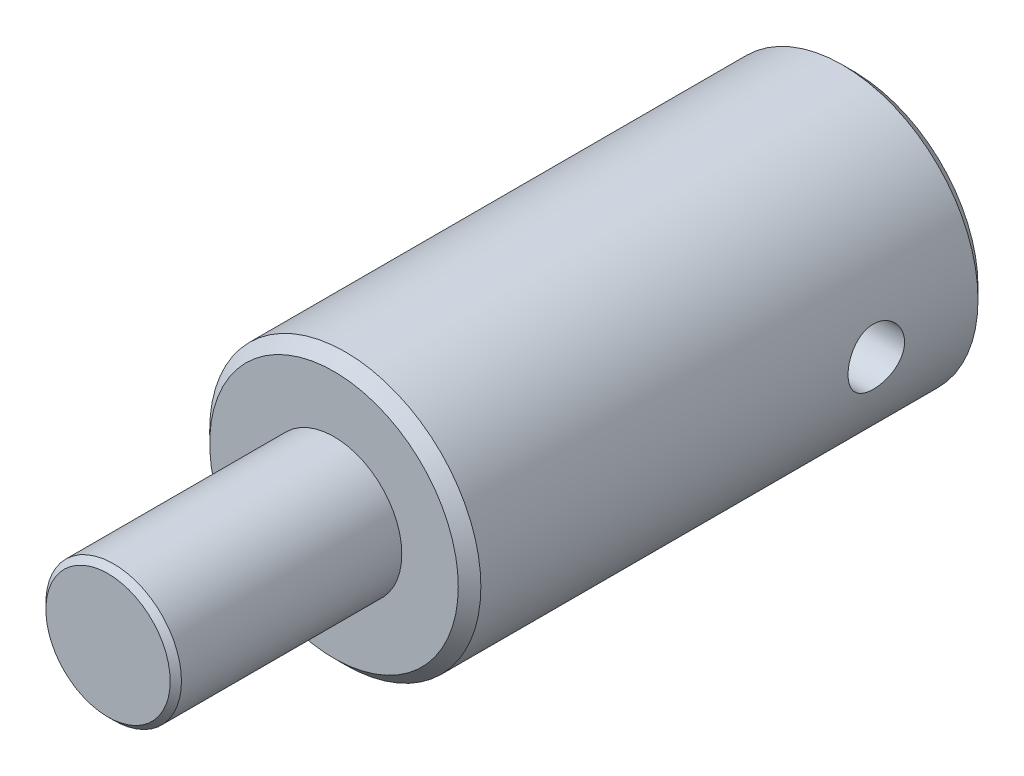
ISO-10303-21;
HEADER;
FILE_DESCRIPTION(('STEP AP214'),'2;1');
FILE_NAME('part.step','',(''),(''),'','','');
FILE_SCHEMA(('AUTOMOTIVE_DESIGN { 1 0 10303 214 1 1 1 1 }'));
ENDSEC;
DATA;
#1=APPLICATION_CONTEXT('core data for automotive mechanical design processes');
#2=APPLICATION_PROTOCOL_DEFINITION('international standard','automotive_design',2000,#1);
#3=PRODUCT_CONTEXT('',#1,'mechanical');
#4=PRODUCT('Part','Part','',(#3));
#5=PRODUCT_RELATED_PRODUCT_CATEGORY('part','',(#4));
#6=PRODUCT_DEFINITION_FORMATION('','',#4);
#7=PRODUCT_DEFINITION_CONTEXT('part definition',#1,'design');
#8=PRODUCT_DEFINITION('design','',#6,#7);
#9=PRODUCT_DEFINITION_SHAPE('','',#8);
#10=(LENGTH_UNIT() NAMED_UNIT(*) SI_UNIT(.MILLI.,.METRE.));
#11=(NAMED_UNIT(*) PLANE_ANGLE_UNIT() SI_UNIT($,.RADIAN.));
#12=(NAMED_UNIT(*) SI_UNIT($,.STERADIAN.) SOLID_ANGLE_UNIT());
#13=UNCERTAINTY_MEASURE_WITH_UNIT(LENGTH_MEASURE(1.E-05),#10,'distance_accuracy_value','');
#14=(GEOMETRIC_REPRESENTATION_CONTEXT(3) GLOBAL_UNCERTAINTY_ASSIGNED_CONTEXT((#13)) GLOBAL_UNIT_ASSIGNED_CONTEXT((#10,
#11,#12)) REPRESENTATION_CONTEXT('',''));
#15=CARTESIAN_POINT('',(0.,0.,0.));
#16=DIRECTION('',(0.,0.,1.));
#17=DIRECTION('',(1.,0.,0.));
#18=AXIS2_PLACEMENT_3D('',#15,#16,#17);
#19=CARTESIAN_POINT('',(0.,0.,23.));
#20=DIRECTION('',(0.,0.,-1.));
#21=DIRECTION('',(-1.,0.,0.));
#22=AXIS2_PLACEMENT_3D('',#19,#20,#21);
#23=CYLINDRICAL_SURFACE('',#22,6.);
#24=CARTESIAN_POINT('',(-6.,0.,3.75));
#25=CARTESIAN_POINT('',(-5.99999871526651,0.0694090417016607,3.75000247746922));
#26=CARTESIAN_POINT('',(-5.99878328775043,0.138848789520876,3.75580066571875));
#27=CARTESIAN_POINT('',(-5.9940520099068,0.275761316266993,3.77881934953285));
#28=CARTESIAN_POINT('',(-5.99053441189248,0.343232560128313,3.79604852303693));
#29=CARTESIAN_POINT('',(-5.98159109196202,0.474209132291342,3.84137045492182));
#30=CARTESIAN_POINT('',(-5.97616727052645,0.537718336709185,3.86945239599889));
#31=CARTESIAN_POINT('',(-5.96399927809859,0.659120328605958,3.93564960885618));
#32=CARTESIAN_POINT('',(-5.95725516625975,0.717013367534327,3.97376443115583));
#33=CARTESIAN_POINT('',(-5.9430770002465,0.826390324308837,4.05953634019064));
#34=CARTESIAN_POINT('',(-5.93563505848532,0.877780244162685,4.10731200123508));
#35=CARTESIAN_POINT('',(-5.92095657692448,0.971877776769393,4.21079465919511));
#36=CARTESIAN_POINT('',(-5.91372005416683,1.01458467096099,4.26650231187226));
#37=CARTESIAN_POINT('',(-5.90019442595308,1.09051031677217,4.38495196876616));
#38=CARTESIAN_POINT('',(-5.89391545174828,1.12363054680651,4.44775838450274));
#39=CARTESIAN_POINT('',(-5.8831284065002,1.17881119348064,4.57819745177276));
#40=CARTESIAN_POINT('',(-5.87862014467568,1.20087280167641,4.64582958244254));
#41=CARTESIAN_POINT('',(-5.87196500986122,1.23300240133737,4.78298523741564));
#42=CARTESIAN_POINT('',(-5.86978556855865,1.24323597696799,4.85246835933477));
#43=CARTESIAN_POINT('',(-5.86793690716491,1.25193357655615,4.99219684286263));
#44=CARTESIAN_POINT('',(-5.86826740800981,1.25039890894687,5.0624421188653));
#45=CARTESIAN_POINT('',(-5.87137174319175,1.23573719037197,5.20048102797518));
#46=CARTESIAN_POINT('',(-5.87410533679901,1.2228010523272,5.26829597966121));
#47=CARTESIAN_POINT('',(-5.88164437615942,1.18600543529945,5.40077150964493));
#48=CARTESIAN_POINT('',(-5.88644992841317,1.16214539481382,5.46543192560633));
#49=CARTESIAN_POINT('',(-5.89763191464102,1.10400003213928,5.59030722841598));
#50=CARTESIAN_POINT('',(-5.90401953785585,1.06964002534237,5.65048629652707));
#51=CARTESIAN_POINT('',(-5.91763890010721,0.991522699274818,5.76429574426816));
#52=CARTESIAN_POINT('',(-5.92487074398537,0.947764212262587,5.81792530883598));
#53=CARTESIAN_POINT('',(-5.93953730929909,0.851074921546783,5.91821396108037));
#54=CARTESIAN_POINT('',(-5.94697323199473,0.797981433412082,5.96471616889701));
#55=CARTESIAN_POINT('',(-5.96108088143001,0.684667288611798,6.04818044222897));
#56=CARTESIAN_POINT('',(-5.96775259670236,0.624446525025765,6.0851423645984));
#57=CARTESIAN_POINT('',(-5.97959870942815,0.498405541235478,6.14851008153595));
#58=CARTESIAN_POINT('',(-5.98477039710258,0.4325754619265,6.17489680456712));
#59=CARTESIAN_POINT('',(-5.99301338211281,0.297284620972155,6.21619170483549));
#60=CARTESIAN_POINT('',(-5.99608495596053,0.227824338595089,6.2311013932314));
#61=CARTESIAN_POINT('',(-5.99974275215456,0.0885918657008352,6.24879425206789));
#62=CARTESIAN_POINT('',(-6.00037293537579,0.0188480555261788,6.25179194149425));
#63=CARTESIAN_POINT('',(-5.99919952252774,-0.120143798757714,6.2461550500309));
#64=CARTESIAN_POINT('',(-5.99739607548153,-0.189391872962258,6.2375211813984));
#65=CARTESIAN_POINT('',(-5.99158564979184,-0.324726367119814,6.20904434653047));
#66=CARTESIAN_POINT('',(-5.98760052868077,-0.390837192894207,6.18931251461653));
#67=CARTESIAN_POINT('',(-5.97787227242395,-0.518811446661332,6.13932213957859));
#68=CARTESIAN_POINT('',(-5.97212899744579,-0.580674536336776,6.10906275913402));
#69=CARTESIAN_POINT('',(-5.95941241490714,-0.699294306943495,6.03841962176244));
#70=CARTESIAN_POINT('',(-5.9524239381233,-0.755973219469835,5.99790807043094));
#71=CARTESIAN_POINT('',(-5.93802568299709,-0.861805445886521,5.90808043692373));
#72=CARTESIAN_POINT('',(-5.93061585542511,-0.910957877913287,5.85876332448106));
#73=CARTESIAN_POINT('',(-5.91606024531377,-1.0011786486518,5.7517444230003));
#74=CARTESIAN_POINT('',(-5.90892089307501,-1.04209914600204,5.69391696804472));
#75=CARTESIAN_POINT('',(-5.89585601015805,-1.11364719079243,5.57208371578621));
#76=CARTESIAN_POINT('',(-5.88993042894651,-1.14427516677864,5.50807817586089));
#77=CARTESIAN_POINT('',(-5.88001700708041,-1.19417246443922,5.37603880370177));
#78=CARTESIAN_POINT('',(-5.87601872784687,-1.21350309828032,5.30802896283416));
#79=CARTESIAN_POINT('',(-5.87039184709697,-1.24044038523407,5.16963344950774));
#80=CARTESIAN_POINT('',(-5.86876290660367,-1.24804871544441,5.09924811838056));
#81=CARTESIAN_POINT('',(-5.86807907308506,-1.25125926487611,4.95958659900035));
#82=CARTESIAN_POINT('',(-5.86897402321502,-1.24709542622725,4.89031592977795));
#83=CARTESIAN_POINT('',(-5.87312447254927,-1.22739905314032,4.75348599107978));
#84=CARTESIAN_POINT('',(-5.87637994909626,-1.21186662782266,4.68592670518389));
#85=CARTESIAN_POINT('',(-5.88486132447716,-1.16998217768585,4.55460222810934));
#86=CARTESIAN_POINT('',(-5.8900815700793,-1.14366117568421,4.49082675351307));
#87=CARTESIAN_POINT('',(-5.90190705738738,-1.08097457299757,4.36856122397333));
#88=CARTESIAN_POINT('',(-5.9085124276546,-1.0446080398303,4.31007166036687));
#89=CARTESIAN_POINT('',(-5.92251579551146,-0.962073695342411,4.19887837292055));
#90=CARTESIAN_POINT('',(-5.92992613868404,-0.915737890418226,4.14630087543501));
#91=CARTESIAN_POINT('',(-5.94461839583213,-0.814924438115334,4.04959050677364));
#92=CARTESIAN_POINT('',(-5.9519002798488,-0.760444918832968,4.00545958244851));
#93=CARTESIAN_POINT('',(-5.96561444547638,-0.644134427507703,3.92641142681594));
#94=CARTESIAN_POINT('',(-5.97203596073244,-0.582225921521348,3.89160632011371));
#95=CARTESIAN_POINT('',(-5.98319908494092,-0.453319843998454,3.83294977156998));
#96=CARTESIAN_POINT('',(-5.98794216182101,-0.386326781907244,3.80908875281812));
#97=CARTESIAN_POINT('',(-5.99432499781443,-0.266015292900106,3.77745972171158));
#98=CARTESIAN_POINT('',(-5.99644035661395,-0.213367593727929,3.76718123679114));
#99=CARTESIAN_POINT('',(-5.99927832789758,-0.107152674176537,3.75345054572267));
#100=CARTESIAN_POINT('',(-6.00000099184586,-0.0535854878488719,3.74999808733281));
#101=CARTESIAN_POINT('',(-6.,0.,3.75));
#102=B_SPLINE_CURVE_WITH_KNOTS('',3,(#24,#25,#26,#27,#28,#29,#30,#31,#32,#33,#34,#35,#36,#37,
#38,#39,#40,#41,#42,#43,#44,#45,#46,#47,#48,#49,#50,#51,#52,#53,#54,#55,#56,#57,#58,#59,#60,#61,
#62,#63,#64,#65,#66,#67,#68,#69,#70,#71,#72,#73,#74,#75,#76,#77,#78,#79,#80,#81,#82,#83,#84,#85,
#86,#87,#88,#89,#90,#91,#92,#93,#94,#95,#96,#97,#98,#99,#100,#101),.UNSPECIFIED.,.T.,.F.,(4,2,2,
2,2,2,2,2,2,2,2,2,2,2,2,2,2,2,2,2,2,2,2,2,2,2,2,2,2,2,2,2,2,2,2,2,2,2,4),(0.,0.208031045103183,
0.416220199906225,0.624202378825443,0.83217524157299,1.04287526388123,1.25359271551786,
1.46640449178549,1.6791933328549,1.88896575169855,2.09871484767165,2.3050171212906,
2.5113300003028,2.71914592416749,2.92698768368035,3.13889526355466,3.35080602278218,
3.56309724499663,3.77536051045772,3.98378339407676,4.19219351552278,4.39855286632622,
4.60492863390934,4.81401583995737,5.02312752564574,5.23571263829337,5.4482888985131,
5.65970050095025,5.87108185414185,6.07829223291039,6.28550062281362,6.49211731393256,
6.6987531908148,6.9091902483031,7.1196757511737,7.33258864398257,7.54531486464974,
7.70592588477281,7.86653096973392),.UNSPECIFIED.);
#103=CARTESIAN_POINT('',(-6.,0.,3.75));
#104=VERTEX_POINT('',#103);
#105=EDGE_CURVE('E10',#104,#104,#102,.T.);
#106=ORIENTED_EDGE('',*,*,#105,.T.);
#107=EDGE_LOOP('',(#106));
#108=FACE_BOUND('',#107,.T.);
#109=CARTESIAN_POINT('',(6.,0.,3.75));
#110=CARTESIAN_POINT('',(5.99999871526651,-0.0694090417016608,3.75000247746922));
#111=CARTESIAN_POINT('',(5.99878328775043,-0.138848789520876,3.75580066571875));
#112=CARTESIAN_POINT('',(5.9940520099068,-0.275761316266994,3.77881934953285));
#113=CARTESIAN_POINT('',(5.99053441189248,-0.343232560128313,3.79604852303693));
#114=CARTESIAN_POINT('',(5.98159109196202,-0.474209132291343,3.84137045492182));
#115=CARTESIAN_POINT('',(5.97616727052645,-0.537718336709186,3.86945239599889));
#116=CARTESIAN_POINT('',(5.96399927809859,-0.659120328605959,3.93564960885618));
#117=CARTESIAN_POINT('',(5.95725516625975,-0.717013367534327,3.97376443115583));
#118=CARTESIAN_POINT('',(5.9430770002465,-0.826390324308838,4.05953634019065));
#119=CARTESIAN_POINT('',(5.93563505848531,-0.877780244162686,4.10731200123508));
#120=CARTESIAN_POINT('',(5.92095657692448,-0.971877776769394,4.21079465919511));
#121=CARTESIAN_POINT('',(5.91372005416683,-1.01458467096099,4.26650231187226));
#122=CARTESIAN_POINT('',(5.90019442595308,-1.09051031677217,4.38495196876616));
#123=CARTESIAN_POINT('',(5.89391545174828,-1.12363054680651,4.44775838450274));
#124=CARTESIAN_POINT('',(5.8831284065002,-1.17881119348064,4.57819745177276));
#125=CARTESIAN_POINT('',(5.87862014467568,-1.20087280167641,4.64582958244254));
#126=CARTESIAN_POINT('',(5.87196500986123,-1.23300240133737,4.78298523741564));
#127=CARTESIAN_POINT('',(5.86978556855865,-1.24323597696799,4.85246835933477));
#128=CARTESIAN_POINT('',(5.86793690716491,-1.25193357655615,4.99219684286263));
#129=CARTESIAN_POINT('',(5.86826740800981,-1.25039890894687,5.0624421188653));
#130=CARTESIAN_POINT('',(5.87137174319175,-1.23573719037197,5.20048102797518));
#131=CARTESIAN_POINT('',(5.87410533679901,-1.2228010523272,5.26829597966121));
#132=CARTESIAN_POINT('',(5.88164437615942,-1.18600543529945,5.40077150964493));
#133=CARTESIAN_POINT('',(5.88644992841317,-1.16214539481382,5.46543192560633));
#134=CARTESIAN_POINT('',(5.89763191464102,-1.10400003213928,5.59030722841598));
#135=CARTESIAN_POINT('',(5.90401953785586,-1.06964002534237,5.65048629652707));
#136=CARTESIAN_POINT('',(5.91763890010721,-0.991522699274818,5.76429574426816));
#137=CARTESIAN_POINT('',(5.92487074398537,-0.947764212262588,5.81792530883598));
#138=CARTESIAN_POINT('',(5.93953730929909,-0.851074921546783,5.91821396108037));
#139=CARTESIAN_POINT('',(5.94697323199473,-0.797981433412082,5.96471616889701));
#140=CARTESIAN_POINT('',(5.96108088143001,-0.684667288611798,6.04818044222897));
#141=CARTESIAN_POINT('',(5.96775259670236,-0.624446525025765,6.0851423645984));
#142=CARTESIAN_POINT('',(5.97959870942815,-0.498405541235478,6.14851008153595));
#143=CARTESIAN_POINT('',(5.98477039710258,-0.4325754619265,6.17489680456712));
#144=CARTESIAN_POINT('',(5.99301338211281,-0.297284620972155,6.21619170483549));
#145=CARTESIAN_POINT('',(5.99608495596053,-0.227824338595089,6.2311013932314));
#146=CARTESIAN_POINT('',(5.99974275215456,-0.088591865700835,6.24879425206789));
#147=CARTESIAN_POINT('',(6.00037293537579,-0.0188480555261784,6.25179194149425));
#148=CARTESIAN_POINT('',(5.99919952252774,0.120143798757715,6.2461550500309));
#149=CARTESIAN_POINT('',(5.99739607548153,0.189391872962258,6.2375211813984));
#150=CARTESIAN_POINT('',(5.99158564979184,0.324726367119814,6.20904434653047));
#151=CARTESIAN_POINT('',(5.98760052868077,0.390837192894207,6.18931251461653));
#152=CARTESIAN_POINT('',(5.97787227242395,0.518811446661332,6.13932213957859));
#153=CARTESIAN_POINT('',(5.97212899744579,0.580674536336776,6.10906275913402));
#154=CARTESIAN_POINT('',(5.95941241490714,0.699294306943495,6.03841962176244));
#155=CARTESIAN_POINT('',(5.9524239381233,0.755973219469835,5.99790807043094));
#156=CARTESIAN_POINT('',(5.93802568299709,0.861805445886521,5.90808043692373));
#157=CARTESIAN_POINT('',(5.93061585542511,0.910957877913287,5.85876332448106));
#158=CARTESIAN_POINT('',(5.91606024531377,1.0011786486518,5.7517444230003));
#159=CARTESIAN_POINT('',(5.90892089307501,1.04209914600204,5.69391696804472));
#160=CARTESIAN_POINT('',(5.89585601015805,1.11364719079243,5.57208371578621));
#161=CARTESIAN_POINT('',(5.88993042894651,1.14427516677864,5.50807817586089));
#162=CARTESIAN_POINT('',(5.88001700708041,1.19417246443922,5.37603880370177));
#163=CARTESIAN_POINT('',(5.87601872784687,1.21350309828032,5.30802896283416));
#164=CARTESIAN_POINT('',(5.87039184709697,1.24044038523407,5.16963344950774));
#165=CARTESIAN_POINT('',(5.86876290660367,1.24804871544441,5.09924811838056));
#166=CARTESIAN_POINT('',(5.86807907308506,1.25125926487611,4.95958659900035));
#167=CARTESIAN_POINT('',(5.86897402321502,1.24709542622725,4.89031592977795));
#168=CARTESIAN_POINT('',(5.87312447254927,1.22739905314032,4.75348599107978));
#169=CARTESIAN_POINT('',(5.87637994909626,1.21186662782266,4.68592670518389));
#170=CARTESIAN_POINT('',(5.88486132447716,1.16998217768585,4.55460222810934));
#171=CARTESIAN_POINT('',(5.8900815700793,1.14366117568421,4.49082675351307));
#172=CARTESIAN_POINT('',(5.90190705738738,1.08097457299757,4.36856122397333));
#173=CARTESIAN_POINT('',(5.9085124276546,1.0446080398303,4.31007166036687));
#174=CARTESIAN_POINT('',(5.92251579551146,0.962073695342411,4.19887837292056));
#175=CARTESIAN_POINT('',(5.92992613868404,0.915737890418227,4.14630087543502));
#176=CARTESIAN_POINT('',(5.94461839583213,0.814924438115335,4.04959050677364));
#177=CARTESIAN_POINT('',(5.9519002798488,0.760444918832969,4.00545958244852));
#178=CARTESIAN_POINT('',(5.96561444547638,0.644134427507704,3.92641142681594));
#179=CARTESIAN_POINT('',(5.97203596073244,0.582225921521349,3.89160632011371));
#180=CARTESIAN_POINT('',(5.98319908494092,0.453319843998455,3.83294977156998));
#181=CARTESIAN_POINT('',(5.98794216182101,0.386326781907245,3.80908875281812));
#182=CARTESIAN_POINT('',(5.99432499781444,0.266015292900106,3.77745972171158));
#183=CARTESIAN_POINT('',(5.99644035661395,0.213367593727929,3.76718123679114));
#184=CARTESIAN_POINT('',(5.99927832789758,0.107152674176537,3.75345054572267));
#185=CARTESIAN_POINT('',(6.00000099184586,0.053585487848872,3.74999808733281));
#186=CARTESIAN_POINT('',(6.,0.,3.75));
#187=B_SPLINE_CURVE_WITH_KNOTS('',3,(#109,#110,#111,#112,#113,#114,#115,#116,#117,#118,#119,
#120,#121,#122,#123,#124,#125,#126,#127,#128,#129,#130,#131,#132,#133,#134,#135,#136,#137,#138,
#139,#140,#141,#142,#143,#144,#145,#146,#147,#148,#149,#150,#151,#152,#153,#154,#155,#156,#157,
#158,#159,#160,#161,#162,#163,#164,#165,#166,#167,#168,#169,#170,#171,#172,#173,#174,#175,#176,
#177,#178,#179,#180,#181,#182,#183,#184,#185,#186),.UNSPECIFIED.,.T.,.F.,(4,2,2,2,2,2,2,2,2,2,2,
2,2,2,2,2,2,2,2,2,2,2,2,2,2,2,2,2,2,2,2,2,2,2,2,2,2,2,4),(0.,0.208031045103184,
0.416220199906225,0.624202378825444,0.832175241572991,1.04287526388123,1.25359271551786,
1.46640449178549,1.6791933328549,1.88896575169854,2.09871484767165,2.3050171212906,
2.5113300003028,2.71914592416749,2.92698768368035,3.13889526355466,3.35080602278218,
3.56309724499663,3.77536051045772,3.98378339407676,4.19219351552278,4.39855286632622,
4.60492863390933,4.81401583995737,5.02312752564574,5.23571263829337,5.4482888985131,
5.65970050095025,5.87108185414185,6.07829223291039,6.28550062281361,6.49211731393256,
6.6987531908148,6.90919024830309,7.1196757511737,7.33258864398256,7.54531486464974,
7.7059258847728,7.86653096973392),.UNSPECIFIED.);
#188=CARTESIAN_POINT('',(6.,0.,3.75));
#189=VERTEX_POINT('',#188);
#190=EDGE_CURVE('E50',#189,#189,#187,.T.);
#191=ORIENTED_EDGE('',*,*,#190,.T.);
#192=EDGE_LOOP('',(#191));
#193=FACE_BOUND('',#192,.T.);
#194=CARTESIAN_POINT('',(0.,0.,0.5));
#195=DIRECTION('',(0.,0.,1.));
#196=DIRECTION('',(1.,0.,0.));
#197=AXIS2_PLACEMENT_3D('',#194,#195,#196);
#198=CIRCLE('',#197,6.);
#199=CARTESIAN_POINT('',(6.,0.,0.5));
#200=VERTEX_POINT('',#199);
#201=EDGE_CURVE('E98',#200,#200,#198,.T.);
#202=ORIENTED_EDGE('',*,*,#201,.T.);
#203=EDGE_LOOP('',(#202));
#204=FACE_BOUND('',#203,.T.);
#205=CARTESIAN_POINT('',(0.,0.,22.5));
#206=DIRECTION('',(0.,0.,1.));
#207=DIRECTION('',(1.,0.,0.));
#208=AXIS2_PLACEMENT_3D('',#205,#206,#207);
#209=CIRCLE('',#208,6.);
#210=CARTESIAN_POINT('',(6.,0.,22.5));
#211=VERTEX_POINT('',#210);
#212=EDGE_CURVE('E101',#211,#211,#209,.F.);
#213=ORIENTED_EDGE('',*,*,#212,.T.);
#214=EDGE_LOOP('',(#213));
#215=FACE_BOUND('',#214,.T.);
#216=ADVANCED_FACE('F37',(#108,#193,#204,#215),#23,.T.);
#217=CARTESIAN_POINT('',(0.,0.,23.));
#218=DIRECTION('',(0.,0.,1.));
#219=DIRECTION('',(1.,0.,0.));
#220=AXIS2_PLACEMENT_3D('',#217,#218,#219);
#221=PLANE('',#220);
#222=CARTESIAN_POINT('',(0.,0.,23.));
#223=DIRECTION('',(0.,0.,1.));
#224=DIRECTION('',(1.,0.,0.));
#225=AXIS2_PLACEMENT_3D('',#222,#223,#224);
#226=CIRCLE('',#225,5.49999999999999);
#227=CARTESIAN_POINT('',(5.49999999999999,0.,23.));
#228=VERTEX_POINT('',#227);
#229=EDGE_CURVE('E111',#228,#228,#226,.T.);
#230=ORIENTED_EDGE('',*,*,#229,.T.);
#231=EDGE_LOOP('',(#230));
#232=FACE_BOUND('',#231,.T.);
#233=CARTESIAN_POINT('',(0.,0.,23.));
#234=DIRECTION('',(0.,0.,1.));
#235=DIRECTION('',(1.,0.,0.));
#236=AXIS2_PLACEMENT_3D('',#233,#234,#235);
#237=CIRCLE('',#236,3.);
#238=CARTESIAN_POINT('',(3.,0.,23.));
#239=VERTEX_POINT('',#238);
#240=EDGE_CURVE('E103',#239,#239,#237,.T.);
#241=ORIENTED_EDGE('',*,*,#240,.F.);
#242=EDGE_LOOP('',(#241));
#243=FACE_BOUND('',#242,.T.);
#244=ADVANCED_FACE('F83',(#232,#243),#221,.T.);
#245=CARTESIAN_POINT('',(0.,0.,0.));
#246=DIRECTION('',(0.,0.,1.));
#247=DIRECTION('',(1.,0.,0.));
#248=AXIS2_PLACEMENT_3D('',#245,#246,#247);
#249=PLANE('',#248);
#250=CARTESIAN_POINT('',(0.,0.,0.));
#251=DIRECTION('',(0.,0.,1.));
#252=DIRECTION('',(1.,0.,0.));
#253=AXIS2_PLACEMENT_3D('',#250,#251,#252);
#254=CIRCLE('',#253,5.5);
#255=CARTESIAN_POINT('',(5.5,0.,0.));
#256=VERTEX_POINT('',#255);
#257=EDGE_CURVE('E105',#256,#256,#254,.F.);
#258=ORIENTED_EDGE('',*,*,#257,.T.);
#259=EDGE_LOOP('',(#258));
#260=FACE_BOUND('',#259,.T.);
#261=ADVANCED_FACE('F81',(#260),#249,.F.);
#262=CARTESIAN_POINT('',(0.,0.,33.));
#263=DIRECTION('',(0.,0.,-1.));
#264=DIRECTION('',(-1.,0.,0.));
#265=AXIS2_PLACEMENT_3D('',#262,#263,#264);
#266=CYLINDRICAL_SURFACE('',#265,3.);
#267=CARTESIAN_POINT('',(0.,0.,32.75));
#268=DIRECTION('',(0.,0.,1.));
#269=DIRECTION('',(1.,0.,0.));
#270=AXIS2_PLACEMENT_3D('',#267,#268,#269);
#271=CIRCLE('',#270,3.);
#272=CARTESIAN_POINT('',(3.,0.,32.75));
#273=VERTEX_POINT('',#272);
#274=EDGE_CURVE('E54',#273,#273,#271,.F.);
#275=ORIENTED_EDGE('',*,*,#274,.T.);
#276=EDGE_LOOP('',(#275));
#277=FACE_BOUND('',#276,.T.);
#278=ORIENTED_EDGE('',*,*,#240,.T.);
#279=EDGE_LOOP('',(#278));
#280=FACE_BOUND('',#279,.T.);
#281=ADVANCED_FACE('F77',(#277,#280),#266,.T.);
#282=CARTESIAN_POINT('',(0.,0.,33.));
#283=DIRECTION('',(0.,0.,1.));
#284=DIRECTION('',(1.,0.,0.));
#285=AXIS2_PLACEMENT_3D('',#282,#283,#284);
#286=PLANE('',#285);
#287=CARTESIAN_POINT('',(0.,0.,33.));
#288=DIRECTION('',(0.,0.,1.));
#289=DIRECTION('',(1.,0.,0.));
#290=AXIS2_PLACEMENT_3D('',#287,#288,#289);
#291=CIRCLE('',#290,2.75);
#292=CARTESIAN_POINT('',(2.75,0.,33.));
#293=VERTEX_POINT('',#292);
#294=EDGE_CURVE('E58',#293,#293,#291,.T.);
#295=ORIENTED_EDGE('',*,*,#294,.T.);
#296=EDGE_LOOP('',(#295));
#297=FACE_BOUND('',#296,.T.);
#298=ADVANCED_FACE('F72',(#297),#286,.T.);
#299=CARTESIAN_POINT('',(0.,0.,0.5));
#300=DIRECTION('',(0.,0.,1.));
#301=DIRECTION('',(1.,0.,0.));
#302=AXIS2_PLACEMENT_3D('',#299,#300,#301);
#303=CONICAL_SURFACE('',#302,6.,0.785398163397454);
#304=ORIENTED_EDGE('',*,*,#257,.F.);
#305=EDGE_LOOP('',(#304));
#306=FACE_BOUND('',#305,.T.);
#307=ORIENTED_EDGE('',*,*,#201,.F.);
#308=EDGE_LOOP('',(#307));
#309=FACE_BOUND('',#308,.T.);
#310=ADVANCED_FACE('F76',(#306,#309),#303,.T.);
#311=CARTESIAN_POINT('',(0.,0.,23.));
#312=DIRECTION('',(0.,0.,-1.));
#313=DIRECTION('',(-1.,0.,0.));
#314=AXIS2_PLACEMENT_3D('',#311,#312,#313);
#315=CONICAL_SURFACE('',#314,5.49999999999999,0.785398163397447);
#316=ORIENTED_EDGE('',*,*,#212,.F.);
#317=EDGE_LOOP('',(#316));
#318=FACE_BOUND('',#317,.T.);
#319=ORIENTED_EDGE('',*,*,#229,.F.);
#320=EDGE_LOOP('',(#319));
#321=FACE_BOUND('',#320,.T.);
#322=ADVANCED_FACE('F117',(#318,#321),#315,.T.);
#323=CARTESIAN_POINT('',(0.,0.,33.));
#324=DIRECTION('',(0.,0.,-1.));
#325=DIRECTION('',(-1.,0.,0.));
#326=AXIS2_PLACEMENT_3D('',#323,#324,#325);
#327=CONICAL_SURFACE('',#326,2.75,0.785398163397444);
#328=ORIENTED_EDGE('',*,*,#274,.F.);
#329=EDGE_LOOP('',(#328));
#330=FACE_BOUND('',#329,.T.);
#331=ORIENTED_EDGE('',*,*,#294,.F.);
#332=EDGE_LOOP('',(#331));
#333=FACE_BOUND('',#332,.T.);
#334=ADVANCED_FACE('F40',(#330,#333),#327,.T.);
#335=CARTESIAN_POINT('',(-6.,0.,5.));
#336=DIRECTION('',(1.,0.,0.));
#337=DIRECTION('',(0.,0.,-1.));
#338=AXIS2_PLACEMENT_3D('',#335,#336,#337);
#339=CYLINDRICAL_SURFACE('',#338,1.25);
#340=ORIENTED_EDGE('',*,*,#190,.F.);
#341=EDGE_LOOP('',(#340));
#342=FACE_BOUND('',#341,.T.);
#343=ORIENTED_EDGE('',*,*,#105,.F.);
#344=EDGE_LOOP('',(#343));
#345=FACE_BOUND('',#344,.T.);
#346=ADVANCED_FACE('F67',(#342,#345),#339,.F.);
#347=CLOSED_SHELL('',(#216,#244,#261,#281,#298,#310,#322,#334,#346));
#348=MANIFOLD_SOLID_BREP('B2',#347);
#349=ADVANCED_BREP_SHAPE_REPRESENTATION('',(#18,#348),#14);
#350=SHAPE_DEFINITION_REPRESENTATION(#9,#349);
ENDSEC;
END-ISO-10303-21;
